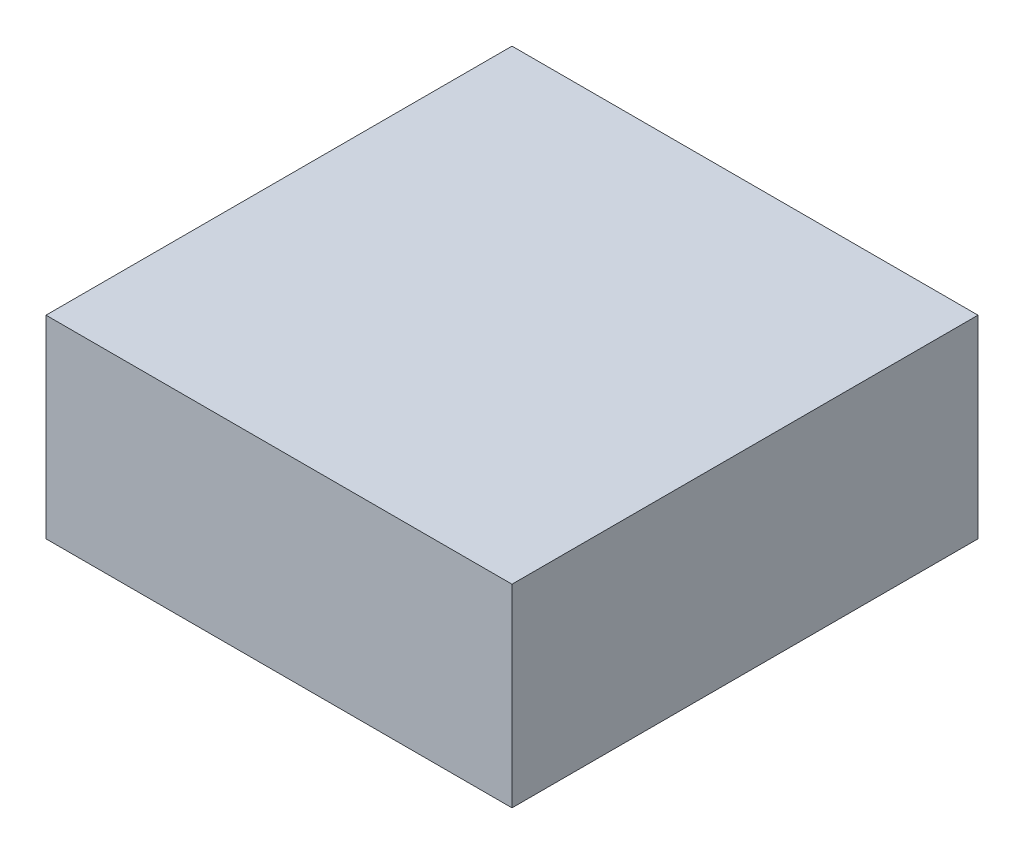
ISO-10303-21;
HEADER;
FILE_DESCRIPTION(('STEP AP214'),'2;1');
FILE_NAME('part.step','',(''),(''),'','','');
FILE_SCHEMA(('AUTOMOTIVE_DESIGN { 1 0 10303 214 1 1 1 1 }'));
ENDSEC;
DATA;
#1=APPLICATION_CONTEXT('core data for automotive mechanical design processes');
#2=APPLICATION_PROTOCOL_DEFINITION('international standard','automotive_design',2000,#1);
#3=PRODUCT_CONTEXT('',#1,'mechanical');
#4=PRODUCT('Part','Part','',(#3));
#5=PRODUCT_RELATED_PRODUCT_CATEGORY('part','',(#4));
#6=PRODUCT_DEFINITION_FORMATION('','',#4);
#7=PRODUCT_DEFINITION_CONTEXT('part definition',#1,'design');
#8=PRODUCT_DEFINITION('design','',#6,#7);
#9=PRODUCT_DEFINITION_SHAPE('','',#8);
#10=(LENGTH_UNIT() NAMED_UNIT(*) SI_UNIT(.MILLI.,.METRE.));
#11=(NAMED_UNIT(*) PLANE_ANGLE_UNIT() SI_UNIT($,.RADIAN.));
#12=(NAMED_UNIT(*) SI_UNIT($,.STERADIAN.) SOLID_ANGLE_UNIT());
#13=UNCERTAINTY_MEASURE_WITH_UNIT(LENGTH_MEASURE(1.E-05),#10,'distance_accuracy_value','');
#14=(GEOMETRIC_REPRESENTATION_CONTEXT(3) GLOBAL_UNCERTAINTY_ASSIGNED_CONTEXT((#13)) GLOBAL_UNIT_ASSIGNED_CONTEXT((#10,
#11,#12)) REPRESENTATION_CONTEXT('',''));
#15=CARTESIAN_POINT('',(0.,0.,0.));
#16=DIRECTION('',(0.,0.,1.));
#17=DIRECTION('',(1.,0.,0.));
#18=AXIS2_PLACEMENT_3D('',#15,#16,#17);
#19=CARTESIAN_POINT('',(0.,18.,0.));
#20=DIRECTION('',(1.,0.,0.));
#21=DIRECTION('',(0.,0.,-1.));
#22=AXIS2_PLACEMENT_3D('',#19,#20,#21);
#23=PLANE('',#22);
#24=DIRECTION('',(0.,0.,1.));
#25=VECTOR('',#24,1.);
#26=CARTESIAN_POINT('',(0.,0.,0.));
#27=LINE('',#26,#25);
#28=CARTESIAN_POINT('',(0.,0.,-43.3));
#29=VERTEX_POINT('',#28);
#30=CARTESIAN_POINT('',(0.,0.,0.));
#31=VERTEX_POINT('',#30);
#32=EDGE_CURVE('E107',#29,#31,#27,.T.);
#33=ORIENTED_EDGE('',*,*,#32,.T.);
#34=DIRECTION('',(0.,-1.,0.));
#35=VECTOR('',#34,1.);
#36=CARTESIAN_POINT('',(0.,18.,0.));
#37=LINE('',#36,#35);
#38=CARTESIAN_POINT('',(0.,18.,0.));
#39=VERTEX_POINT('',#38);
#40=EDGE_CURVE('E11',#39,#31,#37,.T.);
#41=ORIENTED_EDGE('',*,*,#40,.F.);
#42=DIRECTION('',(0.,0.,1.));
#43=VECTOR('',#42,1.);
#44=CARTESIAN_POINT('',(0.,18.,0.));
#45=LINE('',#44,#43);
#46=CARTESIAN_POINT('',(0.,18.,-43.3));
#47=VERTEX_POINT('',#46);
#48=EDGE_CURVE('E91',#47,#39,#45,.T.);
#49=ORIENTED_EDGE('',*,*,#48,.F.);
#50=DIRECTION('',(0.,-1.,0.));
#51=VECTOR('',#50,1.);
#52=CARTESIAN_POINT('',(0.,18.,-43.3));
#53=LINE('',#52,#51);
#54=EDGE_CURVE('E103',#47,#29,#53,.T.);
#55=ORIENTED_EDGE('',*,*,#54,.T.);
#56=EDGE_LOOP('',(#33,#41,#49,#55));
#57=FACE_BOUND('',#56,.T.);
#58=ADVANCED_FACE('F39',(#57),#23,.F.);
#59=CARTESIAN_POINT('',(0.,18.,0.));
#60=DIRECTION('',(0.,0.,-1.));
#61=DIRECTION('',(-1.,0.,0.));
#62=AXIS2_PLACEMENT_3D('',#59,#60,#61);
#63=PLANE('',#62);
#64=DIRECTION('',(1.,0.,0.));
#65=VECTOR('',#64,1.);
#66=CARTESIAN_POINT('',(0.,0.,0.));
#67=LINE('',#66,#65);
#68=CARTESIAN_POINT('',(43.3,0.,0.));
#69=VERTEX_POINT('',#68);
#70=EDGE_CURVE('E96',#31,#69,#67,.T.);
#71=ORIENTED_EDGE('',*,*,#70,.T.);
#72=DIRECTION('',(0.,-1.,0.));
#73=VECTOR('',#72,1.);
#74=CARTESIAN_POINT('',(43.3,18.,0.));
#75=LINE('',#74,#73);
#76=CARTESIAN_POINT('',(43.3,18.,0.));
#77=VERTEX_POINT('',#76);
#78=EDGE_CURVE('E48',#77,#69,#75,.T.);
#79=ORIENTED_EDGE('',*,*,#78,.F.);
#80=DIRECTION('',(1.,0.,0.));
#81=VECTOR('',#80,1.);
#82=CARTESIAN_POINT('',(0.,18.,0.));
#83=LINE('',#82,#81);
#84=EDGE_CURVE('E86',#39,#77,#83,.T.);
#85=ORIENTED_EDGE('',*,*,#84,.F.);
#86=ORIENTED_EDGE('',*,*,#40,.T.);
#87=EDGE_LOOP('',(#71,#79,#85,#86));
#88=FACE_BOUND('',#87,.T.);
#89=ADVANCED_FACE('F95',(#88),#63,.F.);
#90=CARTESIAN_POINT('',(43.3,18.,0.));
#91=DIRECTION('',(-1.,0.,0.));
#92=DIRECTION('',(0.,0.,1.));
#93=AXIS2_PLACEMENT_3D('',#90,#91,#92);
#94=PLANE('',#93);
#95=DIRECTION('',(0.,0.,-1.));
#96=VECTOR('',#95,1.);
#97=CARTESIAN_POINT('',(43.3,0.,0.));
#98=LINE('',#97,#96);
#99=CARTESIAN_POINT('',(43.3,0.,-43.3));
#100=VERTEX_POINT('',#99);
#101=EDGE_CURVE('E73',#69,#100,#98,.T.);
#102=ORIENTED_EDGE('',*,*,#101,.T.);
#103=DIRECTION('',(0.,-1.,0.));
#104=VECTOR('',#103,1.);
#105=CARTESIAN_POINT('',(43.3,18.,-43.3));
#106=LINE('',#105,#104);
#107=CARTESIAN_POINT('',(43.3,18.,-43.3));
#108=VERTEX_POINT('',#107);
#109=EDGE_CURVE('E98',#108,#100,#106,.T.);
#110=ORIENTED_EDGE('',*,*,#109,.F.);
#111=DIRECTION('',(0.,0.,-1.));
#112=VECTOR('',#111,1.);
#113=CARTESIAN_POINT('',(43.3,18.,0.));
#114=LINE('',#113,#112);
#115=EDGE_CURVE('E89',#77,#108,#114,.T.);
#116=ORIENTED_EDGE('',*,*,#115,.F.);
#117=ORIENTED_EDGE('',*,*,#78,.T.);
#118=EDGE_LOOP('',(#102,#110,#116,#117));
#119=FACE_BOUND('',#118,.T.);
#120=ADVANCED_FACE('F99',(#119),#94,.F.);
#121=CARTESIAN_POINT('',(0.,18.,-43.3));
#122=DIRECTION('',(0.,0.,1.));
#123=DIRECTION('',(1.,0.,0.));
#124=AXIS2_PLACEMENT_3D('',#121,#122,#123);
#125=PLANE('',#124);
#126=DIRECTION('',(-1.,0.,0.));
#127=VECTOR('',#126,1.);
#128=CARTESIAN_POINT('',(0.,0.,-43.3));
#129=LINE('',#128,#127);
#130=EDGE_CURVE('E79',#100,#29,#129,.T.);
#131=ORIENTED_EDGE('',*,*,#130,.T.);
#132=ORIENTED_EDGE('',*,*,#54,.F.);
#133=DIRECTION('',(-1.,0.,0.));
#134=VECTOR('',#133,1.);
#135=CARTESIAN_POINT('',(0.,18.,-43.3));
#136=LINE('',#135,#134);
#137=EDGE_CURVE('E56',#108,#47,#136,.T.);
#138=ORIENTED_EDGE('',*,*,#137,.F.);
#139=ORIENTED_EDGE('',*,*,#109,.T.);
#140=EDGE_LOOP('',(#131,#132,#138,#139));
#141=FACE_BOUND('',#140,.T.);
#142=ADVANCED_FACE('F120',(#141),#125,.F.);
#143=CARTESIAN_POINT('',(0.,18.,0.));
#144=DIRECTION('',(0.,-1.,0.));
#145=DIRECTION('',(0.,0.,-1.));
#146=AXIS2_PLACEMENT_3D('',#143,#144,#145);
#147=PLANE('',#146);
#148=ORIENTED_EDGE('',*,*,#48,.T.);
#149=ORIENTED_EDGE('',*,*,#84,.T.);
#150=ORIENTED_EDGE('',*,*,#115,.T.);
#151=ORIENTED_EDGE('',*,*,#137,.T.);
#152=EDGE_LOOP('',(#148,#149,#150,#151));
#153=FACE_BOUND('',#152,.T.);
#154=ADVANCED_FACE('F87',(#153),#147,.F.);
#155=CARTESIAN_POINT('',(0.,0.,0.));
#156=DIRECTION('',(0.,-1.,0.));
#157=DIRECTION('',(0.,0.,-1.));
#158=AXIS2_PLACEMENT_3D('',#155,#156,#157);
#159=PLANE('',#158);
#160=ORIENTED_EDGE('',*,*,#32,.F.);
#161=ORIENTED_EDGE('',*,*,#130,.F.);
#162=ORIENTED_EDGE('',*,*,#101,.F.);
#163=ORIENTED_EDGE('',*,*,#70,.F.);
#164=EDGE_LOOP('',(#160,#161,#162,#163));
#165=FACE_BOUND('',#164,.T.);
#166=ADVANCED_FACE('F123',(#165),#159,.T.);
#167=CLOSED_SHELL('',(#58,#89,#120,#142,#154,#166));
#168=MANIFOLD_SOLID_BREP('B2',#167);
#169=ADVANCED_BREP_SHAPE_REPRESENTATION('',(#18,#168),#14);
#170=SHAPE_DEFINITION_REPRESENTATION(#9,#169);
ENDSEC;
END-ISO-10303-21;
